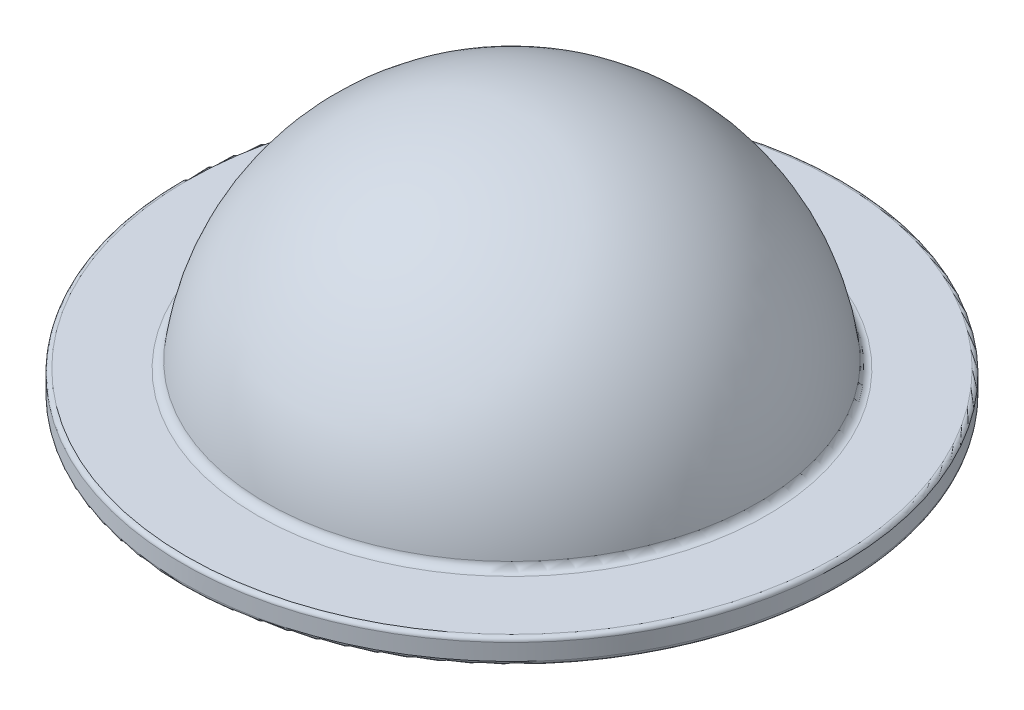
ISO-10303-21;
HEADER;
FILE_DESCRIPTION(('STEP AP214'),'2;1');
FILE_NAME('part.step','',(''),(''),'','','');
FILE_SCHEMA(('AUTOMOTIVE_DESIGN { 1 0 10303 214 1 1 1 1 }'));
ENDSEC;
DATA;
#1=APPLICATION_CONTEXT('core data for automotive mechanical design processes');
#2=APPLICATION_PROTOCOL_DEFINITION('international standard','automotive_design',2000,#1);
#3=PRODUCT_CONTEXT('',#1,'mechanical');
#4=PRODUCT('Part','Part','',(#3));
#5=PRODUCT_RELATED_PRODUCT_CATEGORY('part','',(#4));
#6=PRODUCT_DEFINITION_FORMATION('','',#4);
#7=PRODUCT_DEFINITION_CONTEXT('part definition',#1,'design');
#8=PRODUCT_DEFINITION('design','',#6,#7);
#9=PRODUCT_DEFINITION_SHAPE('','',#8);
#10=(LENGTH_UNIT() NAMED_UNIT(*) SI_UNIT(.MILLI.,.METRE.));
#11=(NAMED_UNIT(*) PLANE_ANGLE_UNIT() SI_UNIT($,.RADIAN.));
#12=(NAMED_UNIT(*) SI_UNIT($,.STERADIAN.) SOLID_ANGLE_UNIT());
#13=UNCERTAINTY_MEASURE_WITH_UNIT(LENGTH_MEASURE(1.E-05),#10,'distance_accuracy_value','');
#14=(GEOMETRIC_REPRESENTATION_CONTEXT(3) GLOBAL_UNCERTAINTY_ASSIGNED_CONTEXT((#13)) GLOBAL_UNIT_ASSIGNED_CONTEXT((#10,
#11,#12)) REPRESENTATION_CONTEXT('',''));
#15=CARTESIAN_POINT('',(0.,0.,0.));
#16=DIRECTION('',(0.,0.,1.));
#17=DIRECTION('',(1.,0.,0.));
#18=AXIS2_PLACEMENT_3D('',#15,#16,#17);
#19=CARTESIAN_POINT('',(0.,0.,0.));
#20=DIRECTION('',(0.,-1.,0.));
#21=DIRECTION('',(-1.,0.,0.));
#22=AXIS2_PLACEMENT_3D('',#19,#20,#21);
#23=SPHERICAL_SURFACE('',#22,27.1496268633627);
#24=CARTESIAN_POINT('',(0.,2.701488842937,0.));
#25=DIRECTION('',(0.,-1.,0.));
#26=DIRECTION('',(0.,0.,-1.));
#27=AXIS2_PLACEMENT_3D('',#24,#25,#26);
#28=CIRCLE('',#27,27.01488842937);
#29=CARTESIAN_POINT('',(0.,2.701488842937,-27.01488842937));
#30=VERTEX_POINT('',#29);
#31=EDGE_CURVE('E60',#30,#30,#28,.T.);
#32=ORIENTED_EDGE('',*,*,#31,.T.);
#33=EDGE_LOOP('',(#32));
#34=FACE_BOUND('',#33,.T.);
#35=ADVANCED_FACE('F37',(#34),#23,.F.);
#36=CARTESIAN_POINT('',(-27.1496268633627,0.,0.));
#37=DIRECTION('',(0.,1.,0.));
#38=DIRECTION('',(0.,0.,1.));
#39=AXIS2_PLACEMENT_3D('',#36,#37,#38);
#40=PLANE('',#39);
#41=CARTESIAN_POINT('',(0.,0.,0.));
#42=DIRECTION('',(0.,1.,0.));
#43=DIRECTION('',(0.,0.,1.));
#44=AXIS2_PLACEMENT_3D('',#41,#42,#43);
#45=CIRCLE('',#44,39.5);
#46=CARTESIAN_POINT('',(0.,0.,39.5));
#47=VERTEX_POINT('',#46);
#48=EDGE_CURVE('E10',#47,#47,#45,.F.);
#49=ORIENTED_EDGE('',*,*,#48,.T.);
#50=EDGE_LOOP('',(#49));
#51=FACE_BOUND('',#50,.T.);
#52=CARTESIAN_POINT('',(0.,0.,0.));
#53=DIRECTION('',(0.,1.,0.));
#54=DIRECTION('',(0.,0.,1.));
#55=AXIS2_PLACEMENT_3D('',#52,#53,#54);
#56=CIRCLE('',#55,30.);
#57=CARTESIAN_POINT('',(0.,0.,30.));
#58=VERTEX_POINT('',#57);
#59=EDGE_CURVE('E57',#58,#58,#56,.T.);
#60=ORIENTED_EDGE('',*,*,#59,.T.);
#61=EDGE_LOOP('',(#60));
#62=FACE_BOUND('',#61,.T.);
#63=ADVANCED_FACE('F90',(#51,#62),#40,.F.);
#64=CARTESIAN_POINT('',(0.,27.1496268633627,0.));
#65=DIRECTION('',(0.,-1.,0.));
#66=DIRECTION('',(0.,0.,-1.));
#67=AXIS2_PLACEMENT_3D('',#64,#65,#66);
#68=CYLINDRICAL_SURFACE('',#67,40.);
#69=CARTESIAN_POINT('',(0.,2.5,0.));
#70=DIRECTION('',(0.,-1.,0.));
#71=DIRECTION('',(0.,0.,-1.));
#72=AXIS2_PLACEMENT_3D('',#69,#70,#71);
#73=CIRCLE('',#72,40.);
#74=CARTESIAN_POINT('',(0.,2.5,-40.));
#75=VERTEX_POINT('',#74);
#76=EDGE_CURVE('E48',#75,#75,#73,.T.);
#77=ORIENTED_EDGE('',*,*,#76,.T.);
#78=EDGE_LOOP('',(#77));
#79=FACE_BOUND('',#78,.T.);
#80=CARTESIAN_POINT('',(0.,0.5,0.));
#81=DIRECTION('',(0.,1.,0.));
#82=DIRECTION('',(0.,0.,1.));
#83=AXIS2_PLACEMENT_3D('',#80,#81,#82);
#84=CIRCLE('',#83,40.);
#85=CARTESIAN_POINT('',(0.,0.5,40.));
#86=VERTEX_POINT('',#85);
#87=EDGE_CURVE('E52',#86,#86,#84,.T.);
#88=ORIENTED_EDGE('',*,*,#87,.T.);
#89=EDGE_LOOP('',(#88));
#90=FACE_BOUND('',#89,.T.);
#91=ADVANCED_FACE('F95',(#79,#90),#68,.T.);
#92=CARTESIAN_POINT('',(-30.,3.,0.));
#93=DIRECTION('',(0.,-1.,0.));
#94=DIRECTION('',(0.,0.,-1.));
#95=AXIS2_PLACEMENT_3D('',#92,#93,#94);
#96=PLANE('',#95);
#97=CARTESIAN_POINT('',(0.,3.,0.));
#98=DIRECTION('',(0.,-1.,0.));
#99=DIRECTION('',(0.,0.,-1.));
#100=AXIS2_PLACEMENT_3D('',#97,#98,#99);
#101=CIRCLE('',#100,39.5);
#102=CARTESIAN_POINT('',(0.,3.,-39.5));
#103=VERTEX_POINT('',#102);
#104=EDGE_CURVE('E44',#103,#103,#101,.F.);
#105=ORIENTED_EDGE('',*,*,#104,.T.);
#106=EDGE_LOOP('',(#105));
#107=FACE_BOUND('',#106,.T.);
#108=CARTESIAN_POINT('',(0.,3.,0.));
#109=DIRECTION('',(0.,-1.,0.));
#110=DIRECTION('',(0.,0.,-1.));
#111=AXIS2_PLACEMENT_3D('',#108,#109,#110);
#112=CIRCLE('',#111,30.89173439169);
#113=CARTESIAN_POINT('',(0.,3.,-30.89173439169));
#114=VERTEX_POINT('',#113);
#115=EDGE_CURVE('E66',#114,#114,#112,.T.);
#116=ORIENTED_EDGE('',*,*,#115,.T.);
#117=EDGE_LOOP('',(#116));
#118=FACE_BOUND('',#117,.T.);
#119=ADVANCED_FACE('F70',(#107,#118),#96,.F.);
#120=CARTESIAN_POINT('',(0.,0.,0.));
#121=DIRECTION('',(0.,-1.,0.));
#122=DIRECTION('',(-1.,0.,0.));
#123=AXIS2_PLACEMENT_3D('',#120,#121,#122);
#124=SPHERICAL_SURFACE('',#123,30.1496268633627);
#125=CARTESIAN_POINT('',(0.,3.87158754685743,0.));
#126=DIRECTION('',(0.,-1.,0.));
#127=DIRECTION('',(0.,0.,-1.));
#128=AXIS2_PLACEMENT_3D('',#125,#126,#127);
#129=CIRCLE('',#128,29.9000135429237);
#130=CARTESIAN_POINT('',(0.,3.87158754685743,-29.9000135429237));
#131=VERTEX_POINT('',#130);
#132=EDGE_CURVE('E63',#131,#131,#129,.F.);
#133=ORIENTED_EDGE('',*,*,#132,.T.);
#134=EDGE_LOOP('',(#133));
#135=FACE_BOUND('',#134,.T.);
#136=ADVANCED_FACE('F75',(#135),#124,.T.);
#137=CARTESIAN_POINT('',(0.,4.,0.));
#138=DIRECTION('',(0.,-1.,0.));
#139=DIRECTION('',(0.,0.,-1.));
#140=AXIS2_PLACEMENT_3D('',#137,#138,#139);
#141=TOROIDAL_SURFACE('',#140,30.89173439169,1.);
#142=ORIENTED_EDGE('',*,*,#132,.F.);
#143=EDGE_LOOP('',(#142));
#144=FACE_BOUND('',#143,.T.);
#145=ORIENTED_EDGE('',*,*,#115,.F.);
#146=EDGE_LOOP('',(#145));
#147=FACE_BOUND('',#146,.T.);
#148=ADVANCED_FACE('F72',(#144,#147),#141,.F.);
#149=CARTESIAN_POINT('',(0.,3.,0.));
#150=DIRECTION('',(0.,1.,0.));
#151=DIRECTION('',(0.,0.,1.));
#152=AXIS2_PLACEMENT_3D('',#149,#150,#151);
#153=TOROIDAL_SURFACE('',#152,30.,3.);
#154=ORIENTED_EDGE('',*,*,#59,.F.);
#155=EDGE_LOOP('',(#154));
#156=FACE_BOUND('',#155,.T.);
#157=ORIENTED_EDGE('',*,*,#31,.F.);
#158=EDGE_LOOP('',(#157));
#159=FACE_BOUND('',#158,.T.);
#160=ADVANCED_FACE('F74',(#156,#159),#153,.T.);
#161=CARTESIAN_POINT('',(0.,2.5,0.));
#162=DIRECTION('',(0.,-1.,0.));
#163=DIRECTION('',(0.,0.,-1.));
#164=AXIS2_PLACEMENT_3D('',#161,#162,#163);
#165=TOROIDAL_SURFACE('',#164,39.5,0.5);
#166=ORIENTED_EDGE('',*,*,#104,.F.);
#167=EDGE_LOOP('',(#166));
#168=FACE_BOUND('',#167,.T.);
#169=ORIENTED_EDGE('',*,*,#76,.F.);
#170=EDGE_LOOP('',(#169));
#171=FACE_BOUND('',#170,.T.);
#172=ADVANCED_FACE('F83',(#168,#171),#165,.T.);
#173=CARTESIAN_POINT('',(0.,0.5,0.));
#174=DIRECTION('',(0.,1.,0.));
#175=DIRECTION('',(0.,0.,1.));
#176=AXIS2_PLACEMENT_3D('',#173,#174,#175);
#177=TOROIDAL_SURFACE('',#176,39.5,0.5);
#178=ORIENTED_EDGE('',*,*,#87,.F.);
#179=EDGE_LOOP('',(#178));
#180=FACE_BOUND('',#179,.T.);
#181=ORIENTED_EDGE('',*,*,#48,.F.);
#182=EDGE_LOOP('',(#181));
#183=FACE_BOUND('',#182,.T.);
#184=ADVANCED_FACE('F39',(#180,#183),#177,.T.);
#185=CLOSED_SHELL('',(#35,#63,#91,#119,#136,#148,#160,#172,#184));
#186=MANIFOLD_SOLID_BREP('B2',#185);
#187=ADVANCED_BREP_SHAPE_REPRESENTATION('',(#18,#186),#14);
#188=SHAPE_DEFINITION_REPRESENTATION(#9,#187);
ENDSEC;
END-ISO-10303-21;
